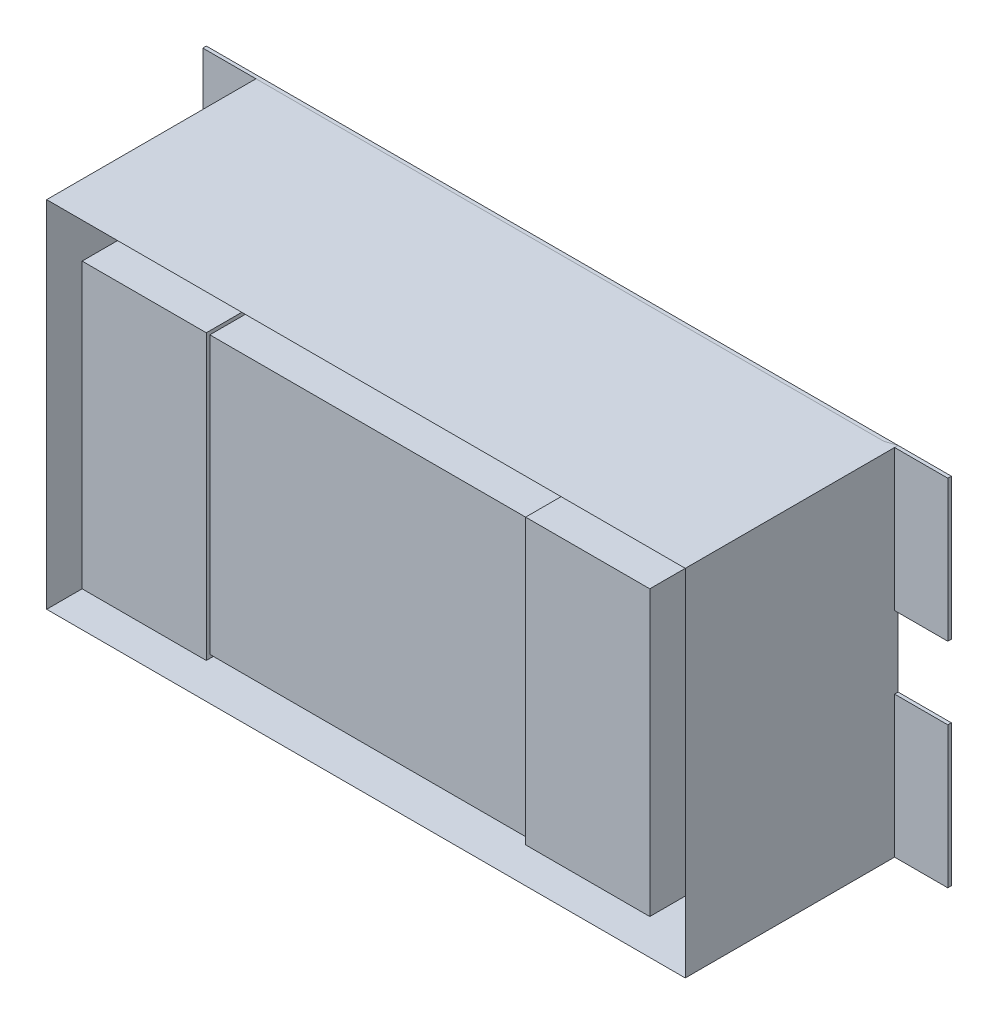
ISO-10303-21;
HEADER;
FILE_DESCRIPTION(('STEP AP214'),'2;1');
FILE_NAME('part.step','',(''),(''),'','','');
FILE_SCHEMA(('AUTOMOTIVE_DESIGN { 1 0 10303 214 1 1 1 1 }'));
ENDSEC;
DATA;
#1=APPLICATION_CONTEXT('core data for automotive mechanical design processes');
#2=APPLICATION_PROTOCOL_DEFINITION('international standard','automotive_design',2000,#1);
#3=PRODUCT_CONTEXT('',#1,'mechanical');
#4=PRODUCT('Part','Part','',(#3));
#5=PRODUCT_RELATED_PRODUCT_CATEGORY('part','',(#4));
#6=PRODUCT_DEFINITION_FORMATION('','',#4);
#7=PRODUCT_DEFINITION_CONTEXT('part definition',#1,'design');
#8=PRODUCT_DEFINITION('design','',#6,#7);
#9=PRODUCT_DEFINITION_SHAPE('','',#8);
#10=(LENGTH_UNIT() NAMED_UNIT(*) SI_UNIT(.MILLI.,.METRE.));
#11=(NAMED_UNIT(*) PLANE_ANGLE_UNIT() SI_UNIT($,.RADIAN.));
#12=(NAMED_UNIT(*) SI_UNIT($,.STERADIAN.) SOLID_ANGLE_UNIT());
#13=UNCERTAINTY_MEASURE_WITH_UNIT(LENGTH_MEASURE(1.E-05),#10,'distance_accuracy_value','');
#14=(GEOMETRIC_REPRESENTATION_CONTEXT(3) GLOBAL_UNCERTAINTY_ASSIGNED_CONTEXT((#13)) GLOBAL_UNIT_ASSIGNED_CONTEXT((#10,
#11,#12)) REPRESENTATION_CONTEXT('',''));
#15=CARTESIAN_POINT('',(0.,0.,0.));
#16=DIRECTION('',(0.,0.,1.));
#17=DIRECTION('',(1.,0.,0.));
#18=AXIS2_PLACEMENT_3D('',#15,#16,#17);
#19=CARTESIAN_POINT('',(1.05,-0.5,0.0762));
#20=DIRECTION('',(1.,0.,0.));
#21=DIRECTION('',(0.,1.,0.));
#22=AXIS2_PLACEMENT_3D('',#19,#20,#21);
#23=PLANE('',#22);
#24=DIRECTION('',(0.,0.,1.));
#25=VECTOR('',#24,1.);
#26=CARTESIAN_POINT('',(1.05,-0.102,0.0762));
#27=LINE('',#26,#25);
#28=CARTESIAN_POINT('',(1.05,-0.102,0.0762));
#29=VERTEX_POINT('',#28);
#30=CARTESIAN_POINT('',(1.05,-0.102,0.0862));
#31=VERTEX_POINT('',#30);
#32=EDGE_CURVE('P0_E253',#29,#31,#27,.T.);
#33=ORIENTED_EDGE('',*,*,#32,.T.);
#34=DIRECTION('',(0.,1.,0.));
#35=VECTOR('',#34,1.);
#36=CARTESIAN_POINT('',(1.05,-0.5,0.0862));
#37=LINE('',#36,#35);
#38=CARTESIAN_POINT('',(1.05,-0.5,0.0862));
#39=VERTEX_POINT('',#38);
#40=EDGE_CURVE('P0_E391',#39,#31,#37,.T.);
#41=ORIENTED_EDGE('',*,*,#40,.F.);
#42=DIRECTION('',(0.,0.,1.));
#43=VECTOR('',#42,1.);
#44=CARTESIAN_POINT('',(1.05,-0.5,0.0762));
#45=LINE('',#44,#43);
#46=CARTESIAN_POINT('',(1.05,-0.5,0.0762));
#47=VERTEX_POINT('',#46);
#48=EDGE_CURVE('P0_E11',#47,#39,#45,.T.);
#49=ORIENTED_EDGE('',*,*,#48,.F.);
#50=DIRECTION('',(0.,1.,0.));
#51=VECTOR('',#50,1.);
#52=CARTESIAN_POINT('',(1.05,-0.5,0.0762));
#53=LINE('',#52,#51);
#54=EDGE_CURVE('P0_E318',#47,#29,#53,.T.);
#55=ORIENTED_EDGE('',*,*,#54,.T.);
#56=EDGE_LOOP('',(#33,#41,#49,#55));
#57=FACE_BOUND('',#56,.T.);
#58=ADVANCED_FACE('P0_F18',(#57),#23,.T.);
#59=CARTESIAN_POINT('',(-1.05,-0.5,0.0762));
#60=DIRECTION('',(0.,-1.,0.));
#61=DIRECTION('',(0.,0.,-1.));
#62=AXIS2_PLACEMENT_3D('',#59,#60,#61);
#63=PLANE('',#62);
#64=ORIENTED_EDGE('',*,*,#48,.T.);
#65=DIRECTION('',(1.,0.,0.));
#66=VECTOR('',#65,1.);
#67=CARTESIAN_POINT('',(-1.05,-0.5,0.0862));
#68=LINE('',#67,#66);
#69=CARTESIAN_POINT('',(-1.05,-0.5,0.0862));
#70=VERTEX_POINT('',#69);
#71=EDGE_CURVE('P0_E236',#70,#39,#68,.T.);
#72=ORIENTED_EDGE('',*,*,#71,.F.);
#73=DIRECTION('',(0.,0.,1.));
#74=VECTOR('',#73,1.);
#75=CARTESIAN_POINT('',(-1.05,-0.5,0.0762));
#76=LINE('',#75,#74);
#77=CARTESIAN_POINT('',(-1.05,-0.5,0.0762));
#78=VERTEX_POINT('',#77);
#79=EDGE_CURVE('P0_E29',#78,#70,#76,.T.);
#80=ORIENTED_EDGE('',*,*,#79,.F.);
#81=DIRECTION('',(1.,0.,0.));
#82=VECTOR('',#81,1.);
#83=CARTESIAN_POINT('',(-1.05,-0.5,0.0762));
#84=LINE('',#83,#82);
#85=EDGE_CURVE('P0_E314',#78,#47,#84,.T.);
#86=ORIENTED_EDGE('',*,*,#85,.T.);
#87=EDGE_LOOP('',(#64,#72,#80,#86));
#88=FACE_BOUND('',#87,.T.);
#89=ADVANCED_FACE('P0_F1241',(#88),#63,.T.);
#90=CARTESIAN_POINT('',(-1.05,-0.102,0.0762));
#91=DIRECTION('',(-1.,0.,0.));
#92=DIRECTION('',(0.,0.,1.));
#93=AXIS2_PLACEMENT_3D('',#90,#91,#92);
#94=PLANE('',#93);
#95=ORIENTED_EDGE('',*,*,#79,.T.);
#96=DIRECTION('',(0.,-1.,0.));
#97=VECTOR('',#96,1.);
#98=CARTESIAN_POINT('',(-1.05,-0.102,0.0862));
#99=LINE('',#98,#97);
#100=CARTESIAN_POINT('',(-1.05,-0.102,0.0862));
#101=VERTEX_POINT('',#100);
#102=EDGE_CURVE('P0_E289',#101,#70,#99,.T.);
#103=ORIENTED_EDGE('',*,*,#102,.F.);
#104=DIRECTION('',(0.,0.,1.));
#105=VECTOR('',#104,1.);
#106=CARTESIAN_POINT('',(-1.05,-0.102,0.0762));
#107=LINE('',#106,#105);
#108=CARTESIAN_POINT('',(-1.05,-0.102,0.0762));
#109=VERTEX_POINT('',#108);
#110=EDGE_CURVE('P0_E249',#109,#101,#107,.T.);
#111=ORIENTED_EDGE('',*,*,#110,.F.);
#112=DIRECTION('',(0.,-1.,0.));
#113=VECTOR('',#112,1.);
#114=CARTESIAN_POINT('',(-1.05,-0.102,0.0762));
#115=LINE('',#114,#113);
#116=EDGE_CURVE('P0_E308',#109,#78,#115,.T.);
#117=ORIENTED_EDGE('',*,*,#116,.T.);
#118=EDGE_LOOP('',(#95,#103,#111,#117));
#119=FACE_BOUND('',#118,.T.);
#120=ADVANCED_FACE('P0_F1279',(#119),#94,.T.);
#121=CARTESIAN_POINT('',(1.05,-0.102,0.0762));
#122=DIRECTION('',(0.,1.,0.));
#123=DIRECTION('',(1.,0.,0.));
#124=AXIS2_PLACEMENT_3D('',#121,#122,#123);
#125=PLANE('',#124);
#126=DIRECTION('',(-1.,0.,0.));
#127=VECTOR('',#126,1.);
#128=CARTESIAN_POINT('',(0.45,-0.102,0.0862));
#129=LINE('',#128,#127);
#130=CARTESIAN_POINT('',(0.45,-0.102,0.0862));
#131=VERTEX_POINT('',#130);
#132=CARTESIAN_POINT('',(-0.45,-0.102,0.0862));
#133=VERTEX_POINT('',#132);
#134=EDGE_CURVE('P0_E279',#131,#133,#129,.T.);
#135=ORIENTED_EDGE('',*,*,#134,.F.);
#136=DIRECTION('',(0.,0.,1.));
#137=VECTOR('',#136,1.);
#138=CARTESIAN_POINT('',(0.45,-0.102,0.0762));
#139=LINE('',#138,#137);
#140=CARTESIAN_POINT('',(0.45,-0.102,0.0762));
#141=VERTEX_POINT('',#140);
#142=EDGE_CURVE('P0_E270',#141,#131,#139,.T.);
#143=ORIENTED_EDGE('',*,*,#142,.F.);
#144=DIRECTION('',(-1.,0.,0.));
#145=VECTOR('',#144,1.);
#146=CARTESIAN_POINT('',(0.45,-0.102,0.0762));
#147=LINE('',#146,#145);
#148=CARTESIAN_POINT('',(-0.45,-0.102,0.0762));
#149=VERTEX_POINT('',#148);
#150=EDGE_CURVE('P0_E215',#141,#149,#147,.T.);
#151=ORIENTED_EDGE('',*,*,#150,.T.);
#152=DIRECTION('',(0.,0.,1.));
#153=VECTOR('',#152,1.);
#154=CARTESIAN_POINT('',(-0.45,-0.102,0.0762));
#155=LINE('',#154,#153);
#156=EDGE_CURVE('P0_E203',#149,#133,#155,.T.);
#157=ORIENTED_EDGE('',*,*,#156,.T.);
#158=EDGE_LOOP('',(#135,#143,#151,#157));
#159=FACE_BOUND('',#158,.T.);
#160=ADVANCED_FACE('P0_F1274',(#159),#125,.T.);
#161=CARTESIAN_POINT('',(1.05,-0.102,0.0762));
#162=DIRECTION('',(0.,1.,0.));
#163=DIRECTION('',(1.,0.,0.));
#164=AXIS2_PLACEMENT_3D('',#161,#162,#163);
#165=PLANE('',#164);
#166=DIRECTION('',(-1.,0.,0.));
#167=VECTOR('',#166,1.);
#168=CARTESIAN_POINT('',(1.05,-0.102,0.0862));
#169=LINE('',#168,#167);
#170=CARTESIAN_POINT('',(0.8,-0.102,0.0862));
#171=VERTEX_POINT('',#170);
#172=EDGE_CURVE('P0_E395',#31,#171,#169,.T.);
#173=ORIENTED_EDGE('',*,*,#172,.F.);
#174=ORIENTED_EDGE('',*,*,#32,.F.);
#175=DIRECTION('',(-1.,0.,0.));
#176=VECTOR('',#175,1.);
#177=CARTESIAN_POINT('',(1.05,-0.102,0.0762));
#178=LINE('',#177,#176);
#179=CARTESIAN_POINT('',(0.8,-0.102,0.0762));
#180=VERTEX_POINT('',#179);
#181=EDGE_CURVE('P0_E322',#29,#180,#178,.T.);
#182=ORIENTED_EDGE('',*,*,#181,.T.);
#183=DIRECTION('',(0.,0.,1.));
#184=VECTOR('',#183,1.);
#185=CARTESIAN_POINT('',(0.8,-0.102,0.0762));
#186=LINE('',#185,#184);
#187=EDGE_CURVE('P0_E303',#180,#171,#186,.T.);
#188=ORIENTED_EDGE('',*,*,#187,.T.);
#189=EDGE_LOOP('',(#173,#174,#182,#188));
#190=FACE_BOUND('',#189,.T.);
#191=ADVANCED_FACE('P0_F1187',(#190),#165,.T.);
#192=CARTESIAN_POINT('',(1.05,-0.102,0.0762));
#193=DIRECTION('',(0.,1.,0.));
#194=DIRECTION('',(1.,0.,0.));
#195=AXIS2_PLACEMENT_3D('',#192,#193,#194);
#196=PLANE('',#195);
#197=DIRECTION('',(-1.,0.,0.));
#198=VECTOR('',#197,1.);
#199=CARTESIAN_POINT('',(-0.8,-0.102,0.0762));
#200=LINE('',#199,#198);
#201=CARTESIAN_POINT('',(-0.8,-0.102,0.0762));
#202=VERTEX_POINT('',#201);
#203=EDGE_CURVE('P0_E232',#202,#109,#200,.T.);
#204=ORIENTED_EDGE('',*,*,#203,.T.);
#205=ORIENTED_EDGE('',*,*,#110,.T.);
#206=DIRECTION('',(-1.,0.,0.));
#207=VECTOR('',#206,1.);
#208=CARTESIAN_POINT('',(-0.8,-0.102,0.0862));
#209=LINE('',#208,#207);
#210=CARTESIAN_POINT('',(-0.8,-0.102,0.0862));
#211=VERTEX_POINT('',#210);
#212=EDGE_CURVE('P0_E293',#211,#101,#209,.T.);
#213=ORIENTED_EDGE('',*,*,#212,.F.);
#214=DIRECTION('',(0.,0.,1.));
#215=VECTOR('',#214,1.);
#216=CARTESIAN_POINT('',(-0.8,-0.102,0.0762));
#217=LINE('',#216,#215);
#218=EDGE_CURVE('P0_E323',#202,#211,#217,.T.);
#219=ORIENTED_EDGE('',*,*,#218,.F.);
#220=EDGE_LOOP('',(#204,#205,#213,#219));
#221=FACE_BOUND('',#220,.T.);
#222=ADVANCED_FACE('P0_F1182',(#221),#196,.T.);
#223=CARTESIAN_POINT('',(1.05,0.102,0.0762));
#224=DIRECTION('',(1.,0.,0.));
#225=DIRECTION('',(0.,1.,0.));
#226=AXIS2_PLACEMENT_3D('',#223,#224,#225);
#227=PLANE('',#226);
#228=DIRECTION('',(0.,0.,1.));
#229=VECTOR('',#228,1.);
#230=CARTESIAN_POINT('',(1.05,0.5,0.0762));
#231=LINE('',#230,#229);
#232=CARTESIAN_POINT('',(1.05,0.5,0.0762));
#233=VERTEX_POINT('',#232);
#234=CARTESIAN_POINT('',(1.05,0.5,0.0862));
#235=VERTEX_POINT('',#234);
#236=EDGE_CURVE('P0_E254',#233,#235,#231,.T.);
#237=ORIENTED_EDGE('',*,*,#236,.T.);
#238=DIRECTION('',(0.,1.,0.));
#239=VECTOR('',#238,1.);
#240=CARTESIAN_POINT('',(1.05,0.102,0.0862));
#241=LINE('',#240,#239);
#242=CARTESIAN_POINT('',(1.05,0.102,0.0862));
#243=VERTEX_POINT('',#242);
#244=EDGE_CURVE('P0_E258',#243,#235,#241,.T.);
#245=ORIENTED_EDGE('',*,*,#244,.F.);
#246=DIRECTION('',(0.,0.,1.));
#247=VECTOR('',#246,1.);
#248=CARTESIAN_POINT('',(1.05,0.102,0.0762));
#249=LINE('',#248,#247);
#250=CARTESIAN_POINT('',(1.05,0.102,0.0762));
#251=VERTEX_POINT('',#250);
#252=EDGE_CURVE('P0_E430',#251,#243,#249,.T.);
#253=ORIENTED_EDGE('',*,*,#252,.F.);
#254=DIRECTION('',(0.,1.,0.));
#255=VECTOR('',#254,1.);
#256=CARTESIAN_POINT('',(1.05,0.102,0.0762));
#257=LINE('',#256,#255);
#258=EDGE_CURVE('P0_E354',#251,#233,#257,.T.);
#259=ORIENTED_EDGE('',*,*,#258,.T.);
#260=EDGE_LOOP('',(#237,#245,#253,#259));
#261=FACE_BOUND('',#260,.T.);
#262=ADVANCED_FACE('P0_F588',(#261),#227,.T.);
#263=CARTESIAN_POINT('',(1.05,0.5,0.0762));
#264=DIRECTION('',(0.,1.,0.));
#265=DIRECTION('',(1.,0.,0.));
#266=AXIS2_PLACEMENT_3D('',#263,#264,#265);
#267=PLANE('',#266);
#268=DIRECTION('',(0.,0.,1.));
#269=VECTOR('',#268,1.);
#270=CARTESIAN_POINT('',(-1.05,0.5,0.0762));
#271=LINE('',#270,#269);
#272=CARTESIAN_POINT('',(-1.05,0.5,0.0762));
#273=VERTEX_POINT('',#272);
#274=CARTESIAN_POINT('',(-1.05,0.5,0.0862));
#275=VERTEX_POINT('',#274);
#276=EDGE_CURVE('P0_E448',#273,#275,#271,.T.);
#277=ORIENTED_EDGE('',*,*,#276,.T.);
#278=DIRECTION('',(-1.,0.,0.));
#279=VECTOR('',#278,1.);
#280=CARTESIAN_POINT('',(1.05,0.5,0.0862));
#281=LINE('',#280,#279);
#282=EDGE_CURVE('P0_E262',#235,#275,#281,.T.);
#283=ORIENTED_EDGE('',*,*,#282,.F.);
#284=ORIENTED_EDGE('',*,*,#236,.F.);
#285=DIRECTION('',(-1.,0.,0.));
#286=VECTOR('',#285,1.);
#287=CARTESIAN_POINT('',(1.05,0.5,0.0762));
#288=LINE('',#287,#286);
#289=EDGE_CURVE('P0_E359',#233,#273,#288,.T.);
#290=ORIENTED_EDGE('',*,*,#289,.T.);
#291=EDGE_LOOP('',(#277,#283,#284,#290));
#292=FACE_BOUND('',#291,.T.);
#293=ADVANCED_FACE('P0_F593',(#292),#267,.T.);
#294=CARTESIAN_POINT('',(-1.05,0.5,0.0762));
#295=DIRECTION('',(-1.,0.,0.));
#296=DIRECTION('',(0.,0.,1.));
#297=AXIS2_PLACEMENT_3D('',#294,#295,#296);
#298=PLANE('',#297);
#299=DIRECTION('',(0.,0.,1.));
#300=VECTOR('',#299,1.);
#301=CARTESIAN_POINT('',(-1.05,0.102,0.0762));
#302=LINE('',#301,#300);
#303=CARTESIAN_POINT('',(-1.05,0.102,0.0762));
#304=VERTEX_POINT('',#303);
#305=CARTESIAN_POINT('',(-1.05,0.102,0.0862));
#306=VERTEX_POINT('',#305);
#307=EDGE_CURVE('P0_E425',#304,#306,#302,.T.);
#308=ORIENTED_EDGE('',*,*,#307,.T.);
#309=DIRECTION('',(0.,-1.,0.));
#310=VECTOR('',#309,1.);
#311=CARTESIAN_POINT('',(-1.05,0.5,0.0862));
#312=LINE('',#311,#310);
#313=EDGE_CURVE('P0_E417',#275,#306,#312,.T.);
#314=ORIENTED_EDGE('',*,*,#313,.F.);
#315=ORIENTED_EDGE('',*,*,#276,.F.);
#316=DIRECTION('',(0.,-1.,0.));
#317=VECTOR('',#316,1.);
#318=CARTESIAN_POINT('',(-1.05,0.5,0.0762));
#319=LINE('',#318,#317);
#320=EDGE_CURVE('P0_E369',#273,#304,#319,.T.);
#321=ORIENTED_EDGE('',*,*,#320,.T.);
#322=EDGE_LOOP('',(#308,#314,#315,#321));
#323=FACE_BOUND('',#322,.T.);
#324=ADVANCED_FACE('P0_F1175',(#323),#298,.T.);
#325=CARTESIAN_POINT('',(-1.05,0.102,0.0762));
#326=DIRECTION('',(0.,-1.,0.));
#327=DIRECTION('',(0.,0.,-1.));
#328=AXIS2_PLACEMENT_3D('',#325,#326,#327);
#329=PLANE('',#328);
#330=DIRECTION('',(1.,0.,0.));
#331=VECTOR('',#330,1.);
#332=CARTESIAN_POINT('',(-0.45,0.102,0.0762));
#333=LINE('',#332,#331);
#334=CARTESIAN_POINT('',(-0.45,0.102,0.0762));
#335=VERTEX_POINT('',#334);
#336=CARTESIAN_POINT('',(0.45,0.102,0.0762));
#337=VERTEX_POINT('',#336);
#338=EDGE_CURVE('P0_E195',#335,#337,#333,.T.);
#339=ORIENTED_EDGE('',*,*,#338,.T.);
#340=DIRECTION('',(0.,0.,1.));
#341=VECTOR('',#340,1.);
#342=CARTESIAN_POINT('',(0.45,0.102,0.0762));
#343=LINE('',#342,#341);
#344=CARTESIAN_POINT('',(0.45,0.102,0.0862));
#345=VERTEX_POINT('',#344);
#346=EDGE_CURVE('P0_E268',#337,#345,#343,.T.);
#347=ORIENTED_EDGE('',*,*,#346,.T.);
#348=DIRECTION('',(1.,0.,0.));
#349=VECTOR('',#348,1.);
#350=CARTESIAN_POINT('',(-0.45,0.102,0.0862));
#351=LINE('',#350,#349);
#352=CARTESIAN_POINT('',(-0.45,0.102,0.0862));
#353=VERTEX_POINT('',#352);
#354=EDGE_CURVE('P0_E197',#353,#345,#351,.T.);
#355=ORIENTED_EDGE('',*,*,#354,.F.);
#356=DIRECTION('',(0.,0.,1.));
#357=VECTOR('',#356,1.);
#358=CARTESIAN_POINT('',(-0.45,0.102,0.0762));
#359=LINE('',#358,#357);
#360=EDGE_CURVE('P0_E190',#335,#353,#359,.T.);
#361=ORIENTED_EDGE('',*,*,#360,.F.);
#362=EDGE_LOOP('',(#339,#347,#355,#361));
#363=FACE_BOUND('',#362,.T.);
#364=ADVANCED_FACE('P0_F192',(#363),#329,.T.);
#365=CARTESIAN_POINT('',(-1.05,0.102,0.0762));
#366=DIRECTION('',(0.,-1.,0.));
#367=DIRECTION('',(0.,0.,-1.));
#368=AXIS2_PLACEMENT_3D('',#365,#366,#367);
#369=PLANE('',#368);
#370=DIRECTION('',(1.,0.,0.));
#371=VECTOR('',#370,1.);
#372=CARTESIAN_POINT('',(0.8,0.102,0.0762));
#373=LINE('',#372,#371);
#374=CARTESIAN_POINT('',(0.8,0.102,0.0762));
#375=VERTEX_POINT('',#374);
#376=EDGE_CURVE('P0_E358',#375,#251,#373,.T.);
#377=ORIENTED_EDGE('',*,*,#376,.T.);
#378=ORIENTED_EDGE('',*,*,#252,.T.);
#379=DIRECTION('',(1.,0.,0.));
#380=VECTOR('',#379,1.);
#381=CARTESIAN_POINT('',(0.8,0.102,0.0862));
#382=LINE('',#381,#380);
#383=CARTESIAN_POINT('',(0.8,0.102,0.0862));
#384=VERTEX_POINT('',#383);
#385=EDGE_CURVE('P0_E263',#384,#243,#382,.T.);
#386=ORIENTED_EDGE('',*,*,#385,.F.);
#387=DIRECTION('',(0.,0.,1.));
#388=VECTOR('',#387,1.);
#389=CARTESIAN_POINT('',(0.8,0.102,0.0762));
#390=LINE('',#389,#388);
#391=EDGE_CURVE('P0_E257',#375,#384,#390,.T.);
#392=ORIENTED_EDGE('',*,*,#391,.F.);
#393=EDGE_LOOP('',(#377,#378,#386,#392));
#394=FACE_BOUND('',#393,.T.);
#395=ADVANCED_FACE('P0_F579',(#394),#369,.T.);
#396=CARTESIAN_POINT('',(-1.05,0.102,0.0762));
#397=DIRECTION('',(0.,-1.,0.));
#398=DIRECTION('',(0.,0.,-1.));
#399=AXIS2_PLACEMENT_3D('',#396,#397,#398);
#400=PLANE('',#399);
#401=DIRECTION('',(1.,0.,0.));
#402=VECTOR('',#401,1.);
#403=CARTESIAN_POINT('',(-1.05,0.102,0.0862));
#404=LINE('',#403,#402);
#405=CARTESIAN_POINT('',(-0.8,0.102,0.0862));
#406=VERTEX_POINT('',#405);
#407=EDGE_CURVE('P0_E421',#306,#406,#404,.T.);
#408=ORIENTED_EDGE('',*,*,#407,.F.);
#409=ORIENTED_EDGE('',*,*,#307,.F.);
#410=DIRECTION('',(1.,0.,0.));
#411=VECTOR('',#410,1.);
#412=CARTESIAN_POINT('',(-1.05,0.102,0.0762));
#413=LINE('',#412,#411);
#414=CARTESIAN_POINT('',(-0.8,0.102,0.0762));
#415=VERTEX_POINT('',#414);
#416=EDGE_CURVE('P0_E373',#304,#415,#413,.T.);
#417=ORIENTED_EDGE('',*,*,#416,.T.);
#418=DIRECTION('',(0.,0.,1.));
#419=VECTOR('',#418,1.);
#420=CARTESIAN_POINT('',(-0.8,0.102,0.0762));
#421=LINE('',#420,#419);
#422=EDGE_CURVE('P0_E328',#415,#406,#421,.T.);
#423=ORIENTED_EDGE('',*,*,#422,.T.);
#424=EDGE_LOOP('',(#408,#409,#417,#423));
#425=FACE_BOUND('',#424,.T.);
#426=ADVANCED_FACE('P0_F515',(#425),#400,.T.);
#427=CARTESIAN_POINT('',(0.,0.,0.6762));
#428=DIRECTION('',(0.,0.,1.));
#429=DIRECTION('',(1.,0.,0.));
#430=AXIS2_PLACEMENT_3D('',#427,#428,#429);
#431=PLANE('',#430);
#432=DIRECTION('',(1.,0.,0.));
#433=VECTOR('',#432,1.);
#434=CARTESIAN_POINT('',(0.45,-0.4,0.6762));
#435=LINE('',#434,#433);
#436=CARTESIAN_POINT('',(0.45,-0.4,0.6762));
#437=VERTEX_POINT('',#436);
#438=CARTESIAN_POINT('',(0.8,-0.4,0.6762));
#439=VERTEX_POINT('',#438);
#440=EDGE_CURVE('P0_E43',#437,#439,#435,.T.);
#441=ORIENTED_EDGE('',*,*,#440,.T.);
#442=DIRECTION('',(0.,1.,0.));
#443=VECTOR('',#442,1.);
#444=CARTESIAN_POINT('',(0.8,-0.4,0.6762));
#445=LINE('',#444,#443);
#446=CARTESIAN_POINT('',(0.8,0.4,0.6762));
#447=VERTEX_POINT('',#446);
#448=EDGE_CURVE('P0_E245',#439,#447,#445,.T.);
#449=ORIENTED_EDGE('',*,*,#448,.T.);
#450=DIRECTION('',(-1.,0.,0.));
#451=VECTOR('',#450,1.);
#452=CARTESIAN_POINT('',(0.8,0.4,0.6762));
#453=LINE('',#452,#451);
#454=CARTESIAN_POINT('',(0.45,0.4,0.6762));
#455=VERTEX_POINT('',#454);
#456=EDGE_CURVE('P0_E298',#447,#455,#453,.T.);
#457=ORIENTED_EDGE('',*,*,#456,.T.);
#458=DIRECTION('',(0.,1.,0.));
#459=VECTOR('',#458,1.);
#460=CARTESIAN_POINT('',(0.45,-0.4,0.6762));
#461=LINE('',#460,#459);
#462=EDGE_CURVE('P0_E364',#437,#455,#461,.T.);
#463=ORIENTED_EDGE('',*,*,#462,.F.);
#464=EDGE_LOOP('',(#441,#449,#457,#463));
#465=FACE_BOUND('',#464,.T.);
#466=ADVANCED_FACE('P0_F1146',(#465),#431,.T.);
#467=CARTESIAN_POINT('',(0.,0.,0.6762));
#468=DIRECTION('',(0.,0.,1.));
#469=DIRECTION('',(1.,0.,0.));
#470=AXIS2_PLACEMENT_3D('',#467,#468,#469);
#471=PLANE('',#470);
#472=DIRECTION('',(-1.,0.,0.));
#473=VECTOR('',#472,1.);
#474=CARTESIAN_POINT('',(-0.45,0.4,0.6762));
#475=LINE('',#474,#473);
#476=CARTESIAN_POINT('',(-0.45,0.4,0.6762));
#477=VERTEX_POINT('',#476);
#478=CARTESIAN_POINT('',(-0.8,0.4,0.6762));
#479=VERTEX_POINT('',#478);
#480=EDGE_CURVE('P0_E300',#477,#479,#475,.T.);
#481=ORIENTED_EDGE('',*,*,#480,.T.);
#482=DIRECTION('',(0.,-1.,0.));
#483=VECTOR('',#482,1.);
#484=CARTESIAN_POINT('',(-0.8,0.4,0.6762));
#485=LINE('',#484,#483);
#486=CARTESIAN_POINT('',(-0.8,-0.4,0.6762));
#487=VERTEX_POINT('',#486);
#488=EDGE_CURVE('P0_E299',#479,#487,#485,.T.);
#489=ORIENTED_EDGE('',*,*,#488,.T.);
#490=DIRECTION('',(1.,0.,0.));
#491=VECTOR('',#490,1.);
#492=CARTESIAN_POINT('',(-0.8,-0.4,0.6762));
#493=LINE('',#492,#491);
#494=CARTESIAN_POINT('',(-0.45,-0.4,0.6762));
#495=VERTEX_POINT('',#494);
#496=EDGE_CURVE('P0_E244',#487,#495,#493,.T.);
#497=ORIENTED_EDGE('',*,*,#496,.T.);
#498=DIRECTION('',(0.,1.,0.));
#499=VECTOR('',#498,1.);
#500=CARTESIAN_POINT('',(-0.45,-0.4,0.6762));
#501=LINE('',#500,#499);
#502=EDGE_CURVE('P0_E313',#495,#477,#501,.T.);
#503=ORIENTED_EDGE('',*,*,#502,.T.);
#504=EDGE_LOOP('',(#481,#489,#497,#503));
#505=FACE_BOUND('',#504,.T.);
#506=ADVANCED_FACE('P0_F1203',(#505),#471,.T.);
#507=CARTESIAN_POINT('',(-0.8,-0.4,0.0762));
#508=DIRECTION('',(0.,-1.,0.));
#509=DIRECTION('',(0.,0.,-1.));
#510=AXIS2_PLACEMENT_3D('',#507,#508,#509);
#511=PLANE('',#510);
#512=DIRECTION('',(0.,0.,1.));
#513=VECTOR('',#512,1.);
#514=CARTESIAN_POINT('',(0.8,-0.4,0.0862));
#515=LINE('',#514,#513);
#516=CARTESIAN_POINT('',(0.8,-0.4,0.0862));
#517=VERTEX_POINT('',#516);
#518=EDGE_CURVE('P0_E242',#517,#439,#515,.T.);
#519=ORIENTED_EDGE('',*,*,#518,.T.);
#520=ORIENTED_EDGE('',*,*,#440,.F.);
#521=DIRECTION('',(0.,0.,1.));
#522=VECTOR('',#521,1.);
#523=CARTESIAN_POINT('',(0.45,-0.4,0.0862));
#524=LINE('',#523,#522);
#525=CARTESIAN_POINT('',(0.45,-0.4,0.0862));
#526=VERTEX_POINT('',#525);
#527=EDGE_CURVE('P0_E360',#526,#437,#524,.T.);
#528=ORIENTED_EDGE('',*,*,#527,.F.);
#529=DIRECTION('',(1.,0.,0.));
#530=VECTOR('',#529,1.);
#531=CARTESIAN_POINT('',(0.45,-0.4,0.0862));
#532=LINE('',#531,#530);
#533=EDGE_CURVE('P0_E275',#526,#517,#532,.T.);
#534=ORIENTED_EDGE('',*,*,#533,.T.);
#535=EDGE_LOOP('',(#519,#520,#528,#534));
#536=FACE_BOUND('',#535,.T.);
#537=ADVANCED_FACE('P0_F1197',(#536),#511,.T.);
#538=CARTESIAN_POINT('',(-0.8,-0.4,0.0762));
#539=DIRECTION('',(0.,-1.,0.));
#540=DIRECTION('',(0.,0.,-1.));
#541=AXIS2_PLACEMENT_3D('',#538,#539,#540);
#542=PLANE('',#541);
#543=DIRECTION('',(0.,0.,1.));
#544=VECTOR('',#543,1.);
#545=CARTESIAN_POINT('',(-0.45,-0.4,0.0862));
#546=LINE('',#545,#544);
#547=CARTESIAN_POINT('',(-0.45,-0.4,0.0862));
#548=VERTEX_POINT('',#547);
#549=EDGE_CURVE('P0_E387',#548,#495,#546,.T.);
#550=ORIENTED_EDGE('',*,*,#549,.T.);
#551=ORIENTED_EDGE('',*,*,#496,.F.);
#552=DIRECTION('',(0.,0.,1.));
#553=VECTOR('',#552,1.);
#554=CARTESIAN_POINT('',(-0.8,-0.4,0.0862));
#555=LINE('',#554,#553);
#556=CARTESIAN_POINT('',(-0.8,-0.4,0.0862));
#557=VERTEX_POINT('',#556);
#558=EDGE_CURVE('P0_E327',#557,#487,#555,.T.);
#559=ORIENTED_EDGE('',*,*,#558,.F.);
#560=DIRECTION('',(1.,0.,0.));
#561=VECTOR('',#560,1.);
#562=CARTESIAN_POINT('',(-0.8,-0.4,0.0862));
#563=LINE('',#562,#561);
#564=EDGE_CURVE('P0_E347',#557,#548,#563,.T.);
#565=ORIENTED_EDGE('',*,*,#564,.T.);
#566=EDGE_LOOP('',(#550,#551,#559,#565));
#567=FACE_BOUND('',#566,.T.);
#568=ADVANCED_FACE('P0_F1202',(#567),#542,.T.);
#569=CARTESIAN_POINT('',(0.8,-0.4,0.0762));
#570=DIRECTION('',(1.,0.,0.));
#571=DIRECTION('',(0.,1.,0.));
#572=AXIS2_PLACEMENT_3D('',#569,#570,#571);
#573=PLANE('',#572);
#574=ORIENTED_EDGE('',*,*,#187,.F.);
#575=DIRECTION('',(0.,1.,0.));
#576=VECTOR('',#575,1.);
#577=CARTESIAN_POINT('',(0.8,-0.102,0.0762));
#578=LINE('',#577,#576);
#579=EDGE_CURVE('P0_E405',#180,#375,#578,.T.);
#580=ORIENTED_EDGE('',*,*,#579,.T.);
#581=ORIENTED_EDGE('',*,*,#391,.T.);
#582=DIRECTION('',(0.,1.,0.));
#583=VECTOR('',#582,1.);
#584=CARTESIAN_POINT('',(0.8,0.102,0.0862));
#585=LINE('',#584,#583);
#586=CARTESIAN_POINT('',(0.8,0.4,0.0862));
#587=VERTEX_POINT('',#586);
#588=EDGE_CURVE('P0_E288',#384,#587,#585,.T.);
#589=ORIENTED_EDGE('',*,*,#588,.T.);
#590=DIRECTION('',(0.,0.,1.));
#591=VECTOR('',#590,1.);
#592=CARTESIAN_POINT('',(0.8,0.4,0.0862));
#593=LINE('',#592,#591);
#594=EDGE_CURVE('P0_E304',#587,#447,#593,.T.);
#595=ORIENTED_EDGE('',*,*,#594,.T.);
#596=ORIENTED_EDGE('',*,*,#448,.F.);
#597=ORIENTED_EDGE('',*,*,#518,.F.);
#598=DIRECTION('',(0.,1.,0.));
#599=VECTOR('',#598,1.);
#600=CARTESIAN_POINT('',(0.8,-0.4,0.0862));
#601=LINE('',#600,#599);
#602=EDGE_CURVE('P0_E280',#517,#171,#601,.T.);
#603=ORIENTED_EDGE('',*,*,#602,.T.);
#604=EDGE_LOOP('',(#574,#580,#581,#589,#595,#596,#597,#603));
#605=FACE_BOUND('',#604,.T.);
#606=ADVANCED_FACE('P0_F585',(#605),#573,.T.);
#607=CARTESIAN_POINT('',(0.8,0.4,0.0762));
#608=DIRECTION('',(0.,1.,0.));
#609=DIRECTION('',(1.,0.,0.));
#610=AXIS2_PLACEMENT_3D('',#607,#608,#609);
#611=PLANE('',#610);
#612=DIRECTION('',(0.,0.,1.));
#613=VECTOR('',#612,1.);
#614=CARTESIAN_POINT('',(-0.8,0.4,0.0862));
#615=LINE('',#614,#613);
#616=CARTESIAN_POINT('',(-0.8,0.4,0.0862));
#617=VERTEX_POINT('',#616);
#618=EDGE_CURVE('P0_E294',#617,#479,#615,.T.);
#619=ORIENTED_EDGE('',*,*,#618,.T.);
#620=ORIENTED_EDGE('',*,*,#480,.F.);
#621=DIRECTION('',(0.,0.,1.));
#622=VECTOR('',#621,1.);
#623=CARTESIAN_POINT('',(-0.45,0.4,0.0862));
#624=LINE('',#623,#622);
#625=CARTESIAN_POINT('',(-0.45,0.4,0.0862));
#626=VERTEX_POINT('',#625);
#627=EDGE_CURVE('P0_E309',#626,#477,#624,.T.);
#628=ORIENTED_EDGE('',*,*,#627,.F.);
#629=DIRECTION('',(-1.,0.,0.));
#630=VECTOR('',#629,1.);
#631=CARTESIAN_POINT('',(-0.45,0.4,0.0862));
#632=LINE('',#631,#630);
#633=EDGE_CURVE('P0_E238',#626,#617,#632,.T.);
#634=ORIENTED_EDGE('',*,*,#633,.T.);
#635=EDGE_LOOP('',(#619,#620,#628,#634));
#636=FACE_BOUND('',#635,.T.);
#637=ADVANCED_FACE('P0_F1228',(#636),#611,.T.);
#638=CARTESIAN_POINT('',(0.8,0.4,0.0762));
#639=DIRECTION('',(0.,1.,0.));
#640=DIRECTION('',(1.,0.,0.));
#641=AXIS2_PLACEMENT_3D('',#638,#639,#640);
#642=PLANE('',#641);
#643=DIRECTION('',(0.,0.,1.));
#644=VECTOR('',#643,1.);
#645=CARTESIAN_POINT('',(0.45,0.4,0.0862));
#646=LINE('',#645,#644);
#647=CARTESIAN_POINT('',(0.45,0.4,0.0862));
#648=VERTEX_POINT('',#647);
#649=EDGE_CURVE('P0_E269',#648,#455,#646,.T.);
#650=ORIENTED_EDGE('',*,*,#649,.T.);
#651=ORIENTED_EDGE('',*,*,#456,.F.);
#652=ORIENTED_EDGE('',*,*,#594,.F.);
#653=DIRECTION('',(-1.,0.,0.));
#654=VECTOR('',#653,1.);
#655=CARTESIAN_POINT('',(0.8,0.4,0.0862));
#656=LINE('',#655,#654);
#657=EDGE_CURVE('P0_E475',#587,#648,#656,.T.);
#658=ORIENTED_EDGE('',*,*,#657,.T.);
#659=EDGE_LOOP('',(#650,#651,#652,#658));
#660=FACE_BOUND('',#659,.T.);
#661=ADVANCED_FACE('P0_F598',(#660),#642,.T.);
#662=CARTESIAN_POINT('',(-0.8,0.4,0.0762));
#663=DIRECTION('',(-1.,0.,0.));
#664=DIRECTION('',(0.,0.,1.));
#665=AXIS2_PLACEMENT_3D('',#662,#663,#664);
#666=PLANE('',#665);
#667=ORIENTED_EDGE('',*,*,#422,.F.);
#668=DIRECTION('',(0.,-1.,0.));
#669=VECTOR('',#668,1.);
#670=CARTESIAN_POINT('',(-0.8,0.102,0.0762));
#671=LINE('',#670,#669);
#672=EDGE_CURVE('P0_E223',#415,#202,#671,.T.);
#673=ORIENTED_EDGE('',*,*,#672,.T.);
#674=ORIENTED_EDGE('',*,*,#218,.T.);
#675=DIRECTION('',(0.,-1.,0.));
#676=VECTOR('',#675,1.);
#677=CARTESIAN_POINT('',(-0.8,-0.102,0.0862));
#678=LINE('',#677,#676);
#679=EDGE_CURVE('P0_E343',#211,#557,#678,.T.);
#680=ORIENTED_EDGE('',*,*,#679,.T.);
#681=ORIENTED_EDGE('',*,*,#558,.T.);
#682=ORIENTED_EDGE('',*,*,#488,.F.);
#683=ORIENTED_EDGE('',*,*,#618,.F.);
#684=DIRECTION('',(0.,-1.,0.));
#685=VECTOR('',#684,1.);
#686=CARTESIAN_POINT('',(-0.8,0.4,0.0862));
#687=LINE('',#686,#685);
#688=EDGE_CURVE('P0_E458',#617,#406,#687,.T.);
#689=ORIENTED_EDGE('',*,*,#688,.T.);
#690=EDGE_LOOP('',(#667,#673,#674,#680,#681,#682,#683,#689));
#691=FACE_BOUND('',#690,.T.);
#692=ADVANCED_FACE('P0_F502',(#691),#666,.T.);
#693=CARTESIAN_POINT('',(0.,0.,0.0862));
#694=DIRECTION('',(0.,0.,1.));
#695=DIRECTION('',(1.,0.,0.));
#696=AXIS2_PLACEMENT_3D('',#693,#694,#695);
#697=PLANE('',#696);
#698=ORIENTED_EDGE('',*,*,#212,.T.);
#699=ORIENTED_EDGE('',*,*,#102,.T.);
#700=ORIENTED_EDGE('',*,*,#71,.T.);
#701=ORIENTED_EDGE('',*,*,#40,.T.);
#702=ORIENTED_EDGE('',*,*,#172,.T.);
#703=ORIENTED_EDGE('',*,*,#602,.F.);
#704=ORIENTED_EDGE('',*,*,#533,.F.);
#705=DIRECTION('',(0.,1.,0.));
#706=VECTOR('',#705,1.);
#707=CARTESIAN_POINT('',(0.45,-0.4,0.0862));
#708=LINE('',#707,#706);
#709=EDGE_CURVE('P0_E274',#526,#131,#708,.T.);
#710=ORIENTED_EDGE('',*,*,#709,.T.);
#711=ORIENTED_EDGE('',*,*,#134,.T.);
#712=DIRECTION('',(0.,1.,0.));
#713=VECTOR('',#712,1.);
#714=CARTESIAN_POINT('',(-0.45,-0.4,0.0862));
#715=LINE('',#714,#713);
#716=EDGE_CURVE('P0_E416',#548,#133,#715,.T.);
#717=ORIENTED_EDGE('',*,*,#716,.F.);
#718=ORIENTED_EDGE('',*,*,#564,.F.);
#719=ORIENTED_EDGE('',*,*,#679,.F.);
#720=EDGE_LOOP('',(#698,#699,#700,#701,#702,#703,#704,#710,#711,#717,#718,#719));
#721=FACE_BOUND('',#720,.T.);
#722=ADVANCED_FACE('P0_F1381',(#721),#697,.T.);
#723=CARTESIAN_POINT('',(0.,0.,0.0862));
#724=DIRECTION('',(0.,0.,1.));
#725=DIRECTION('',(1.,0.,0.));
#726=AXIS2_PLACEMENT_3D('',#723,#724,#725);
#727=PLANE('',#726);
#728=ORIENTED_EDGE('',*,*,#633,.F.);
#729=DIRECTION('',(0.,1.,0.));
#730=VECTOR('',#729,1.);
#731=CARTESIAN_POINT('',(-0.45,0.102,0.0862));
#732=LINE('',#731,#730);
#733=EDGE_CURVE('P0_E202',#353,#626,#732,.T.);
#734=ORIENTED_EDGE('',*,*,#733,.F.);
#735=ORIENTED_EDGE('',*,*,#354,.T.);
#736=DIRECTION('',(0.,1.,0.));
#737=VECTOR('',#736,1.);
#738=CARTESIAN_POINT('',(0.45,0.102,0.0862));
#739=LINE('',#738,#737);
#740=EDGE_CURVE('P0_E264',#345,#648,#739,.T.);
#741=ORIENTED_EDGE('',*,*,#740,.T.);
#742=ORIENTED_EDGE('',*,*,#657,.F.);
#743=ORIENTED_EDGE('',*,*,#588,.F.);
#744=ORIENTED_EDGE('',*,*,#385,.T.);
#745=ORIENTED_EDGE('',*,*,#244,.T.);
#746=ORIENTED_EDGE('',*,*,#282,.T.);
#747=ORIENTED_EDGE('',*,*,#313,.T.);
#748=ORIENTED_EDGE('',*,*,#407,.T.);
#749=ORIENTED_EDGE('',*,*,#688,.F.);
#750=EDGE_LOOP('',(#728,#734,#735,#741,#742,#743,#744,#745,#746,#747,#748,#749));
#751=FACE_BOUND('',#750,.T.);
#752=ADVANCED_FACE('P0_F511',(#751),#727,.T.);
#753=CARTESIAN_POINT('',(-0.45,-0.39,0.6662));
#754=DIRECTION('',(0.,0.,-1.));
#755=DIRECTION('',(0.,-1.,0.));
#756=AXIS2_PLACEMENT_3D('',#753,#754,#755);
#757=PLANE('',#756);
#758=DIRECTION('',(1.,0.,0.));
#759=VECTOR('',#758,1.);
#760=CARTESIAN_POINT('',(-0.45,-0.39,0.6662));
#761=LINE('',#760,#759);
#762=CARTESIAN_POINT('',(-0.45,-0.39,0.6662));
#763=VERTEX_POINT('',#762);
#764=CARTESIAN_POINT('',(0.45,-0.39,0.6662));
#765=VERTEX_POINT('',#764);
#766=EDGE_CURVE('P0_E241',#763,#765,#761,.T.);
#767=ORIENTED_EDGE('',*,*,#766,.T.);
#768=DIRECTION('',(0.,1.,0.));
#769=VECTOR('',#768,1.);
#770=CARTESIAN_POINT('',(0.45,-0.39,0.6662));
#771=LINE('',#770,#769);
#772=CARTESIAN_POINT('',(0.45,0.39,0.6662));
#773=VERTEX_POINT('',#772);
#774=EDGE_CURVE('P0_E374',#765,#773,#771,.T.);
#775=ORIENTED_EDGE('',*,*,#774,.T.);
#776=DIRECTION('',(1.,0.,0.));
#777=VECTOR('',#776,1.);
#778=CARTESIAN_POINT('',(-0.45,0.39,0.6662));
#779=LINE('',#778,#777);
#780=CARTESIAN_POINT('',(-0.45,0.39,0.6662));
#781=VERTEX_POINT('',#780);
#782=EDGE_CURVE('P0_E284',#781,#773,#779,.T.);
#783=ORIENTED_EDGE('',*,*,#782,.F.);
#784=DIRECTION('',(0.,1.,0.));
#785=VECTOR('',#784,1.);
#786=CARTESIAN_POINT('',(-0.45,-0.39,0.6662));
#787=LINE('',#786,#785);
#788=EDGE_CURVE('P0_E411',#763,#781,#787,.T.);
#789=ORIENTED_EDGE('',*,*,#788,.F.);
#790=EDGE_LOOP('',(#767,#775,#783,#789));
#791=FACE_BOUND('',#790,.T.);
#792=ADVANCED_FACE('P0_F1156',(#791),#757,.F.);
#793=CARTESIAN_POINT('',(-0.45,-0.39,0.0862));
#794=DIRECTION('',(0.,1.,0.));
#795=DIRECTION('',(1.,0.,0.));
#796=AXIS2_PLACEMENT_3D('',#793,#794,#795);
#797=PLANE('',#796);
#798=DIRECTION('',(0.,0.,1.));
#799=VECTOR('',#798,1.);
#800=CARTESIAN_POINT('',(0.45,-0.39,0.1012));
#801=LINE('',#800,#799);
#802=CARTESIAN_POINT('',(0.45,-0.39,0.1012));
#803=VERTEX_POINT('',#802);
#804=EDGE_CURVE('P0_E367',#803,#765,#801,.T.);
#805=ORIENTED_EDGE('',*,*,#804,.T.);
#806=ORIENTED_EDGE('',*,*,#766,.F.);
#807=DIRECTION('',(0.,0.,1.));
#808=VECTOR('',#807,1.);
#809=CARTESIAN_POINT('',(-0.45,-0.39,0.1012));
#810=LINE('',#809,#808);
#811=CARTESIAN_POINT('',(-0.45,-0.39,0.1012));
#812=VERTEX_POINT('',#811);
#813=EDGE_CURVE('P0_E415',#812,#763,#810,.T.);
#814=ORIENTED_EDGE('',*,*,#813,.F.);
#815=DIRECTION('',(1.,0.,0.));
#816=VECTOR('',#815,1.);
#817=CARTESIAN_POINT('',(-0.45,-0.39,0.1012));
#818=LINE('',#817,#816);
#819=EDGE_CURVE('P0_E22',#812,#803,#818,.T.);
#820=ORIENTED_EDGE('',*,*,#819,.T.);
#821=EDGE_LOOP('',(#805,#806,#814,#820));
#822=FACE_BOUND('',#821,.T.);
#823=ADVANCED_FACE('P0_F1161',(#822),#797,.F.);
#824=CARTESIAN_POINT('',(-0.45,0.,0.));
#825=DIRECTION('',(1.,0.,0.));
#826=DIRECTION('',(0.,1.,0.));
#827=AXIS2_PLACEMENT_3D('',#824,#825,#826);
#828=PLANE('',#827);
#829=ORIENTED_EDGE('',*,*,#788,.T.);
#830=DIRECTION('',(0.,0.,-1.));
#831=VECTOR('',#830,1.);
#832=CARTESIAN_POINT('',(-0.45,0.39,0.6662));
#833=LINE('',#832,#831);
#834=CARTESIAN_POINT('',(-0.45,0.39,0.1012));
#835=VERTEX_POINT('',#834);
#836=EDGE_CURVE('P0_E329',#781,#835,#833,.T.);
#837=ORIENTED_EDGE('',*,*,#836,.T.);
#838=DIRECTION('',(0.,1.,0.));
#839=VECTOR('',#838,1.);
#840=CARTESIAN_POINT('',(-0.45,-0.39,0.1012));
#841=LINE('',#840,#839);
#842=EDGE_CURVE('P0_E350',#812,#835,#841,.T.);
#843=ORIENTED_EDGE('',*,*,#842,.F.);
#844=ORIENTED_EDGE('',*,*,#813,.T.);
#845=EDGE_LOOP('',(#829,#837,#843,#844));
#846=FACE_BOUND('',#845,.T.);
#847=ORIENTED_EDGE('',*,*,#156,.F.);
#848=DIRECTION('',(0.,1.,0.));
#849=VECTOR('',#848,1.);
#850=CARTESIAN_POINT('',(-0.45,-0.102,0.0762));
#851=LINE('',#850,#849);
#852=EDGE_CURVE('P0_E207',#149,#335,#851,.T.);
#853=ORIENTED_EDGE('',*,*,#852,.T.);
#854=ORIENTED_EDGE('',*,*,#360,.T.);
#855=ORIENTED_EDGE('',*,*,#733,.T.);
#856=ORIENTED_EDGE('',*,*,#627,.T.);
#857=ORIENTED_EDGE('',*,*,#502,.F.);
#858=ORIENTED_EDGE('',*,*,#549,.F.);
#859=ORIENTED_EDGE('',*,*,#716,.T.);
#860=EDGE_LOOP('',(#847,#853,#854,#855,#856,#857,#858,#859));
#861=FACE_BOUND('',#860,.T.);
#862=ADVANCED_FACE('P0_F208',(#846,#861),#828,.T.);
#863=CARTESIAN_POINT('',(-0.45,0.,0.1012));
#864=DIRECTION('',(0.,0.,-1.));
#865=DIRECTION('',(0.,-1.,0.));
#866=AXIS2_PLACEMENT_3D('',#863,#864,#865);
#867=PLANE('',#866);
#868=DIRECTION('',(0.,-1.,0.));
#869=VECTOR('',#868,1.);
#870=CARTESIAN_POINT('',(0.45,0.39,0.1012));
#871=LINE('',#870,#869);
#872=CARTESIAN_POINT('',(0.45,0.39,0.1012));
#873=VERTEX_POINT('',#872);
#874=EDGE_CURVE('P0_E342',#873,#803,#871,.T.);
#875=ORIENTED_EDGE('',*,*,#874,.T.);
#876=ORIENTED_EDGE('',*,*,#819,.F.);
#877=ORIENTED_EDGE('',*,*,#842,.T.);
#878=DIRECTION('',(1.,0.,0.));
#879=VECTOR('',#878,1.);
#880=CARTESIAN_POINT('',(-0.45,0.39,0.1012));
#881=LINE('',#880,#879);
#882=EDGE_CURVE('P0_E281',#835,#873,#881,.T.);
#883=ORIENTED_EDGE('',*,*,#882,.T.);
#884=EDGE_LOOP('',(#875,#876,#877,#883));
#885=FACE_BOUND('',#884,.T.);
#886=ADVANCED_FACE('P0_F1265',(#885),#867,.T.);
#887=CARTESIAN_POINT('',(-0.45,0.39,0.6662));
#888=DIRECTION('',(0.,-1.,0.));
#889=DIRECTION('',(0.,0.,-1.));
#890=AXIS2_PLACEMENT_3D('',#887,#888,#889);
#891=PLANE('',#890);
#892=ORIENTED_EDGE('',*,*,#836,.F.);
#893=ORIENTED_EDGE('',*,*,#782,.T.);
#894=DIRECTION('',(0.,0.,-1.));
#895=VECTOR('',#894,1.);
#896=CARTESIAN_POINT('',(0.45,0.39,0.6662));
#897=LINE('',#896,#895);
#898=EDGE_CURVE('P0_E333',#773,#873,#897,.T.);
#899=ORIENTED_EDGE('',*,*,#898,.T.);
#900=ORIENTED_EDGE('',*,*,#882,.F.);
#901=EDGE_LOOP('',(#892,#893,#899,#900));
#902=FACE_BOUND('',#901,.T.);
#903=ADVANCED_FACE('P0_F1260',(#902),#891,.F.);
#904=CARTESIAN_POINT('',(0.45,0.,0.));
#905=DIRECTION('',(1.,0.,0.));
#906=DIRECTION('',(0.,1.,0.));
#907=AXIS2_PLACEMENT_3D('',#904,#905,#906);
#908=PLANE('',#907);
#909=ORIENTED_EDGE('',*,*,#774,.F.);
#910=ORIENTED_EDGE('',*,*,#804,.F.);
#911=ORIENTED_EDGE('',*,*,#874,.F.);
#912=ORIENTED_EDGE('',*,*,#898,.F.);
#913=EDGE_LOOP('',(#909,#910,#911,#912));
#914=FACE_BOUND('',#913,.T.);
#915=ORIENTED_EDGE('',*,*,#527,.T.);
#916=ORIENTED_EDGE('',*,*,#462,.T.);
#917=ORIENTED_EDGE('',*,*,#649,.F.);
#918=ORIENTED_EDGE('',*,*,#740,.F.);
#919=ORIENTED_EDGE('',*,*,#346,.F.);
#920=DIRECTION('',(0.,1.,0.));
#921=VECTOR('',#920,1.);
#922=CARTESIAN_POINT('',(0.45,-0.102,0.0762));
#923=LINE('',#922,#921);
#924=EDGE_CURVE('P0_E221',#141,#337,#923,.T.);
#925=ORIENTED_EDGE('',*,*,#924,.F.);
#926=ORIENTED_EDGE('',*,*,#142,.T.);
#927=ORIENTED_EDGE('',*,*,#709,.F.);
#928=EDGE_LOOP('',(#915,#916,#917,#918,#919,#925,#926,#927));
#929=FACE_BOUND('',#928,.T.);
#930=ADVANCED_FACE('P0_F20',(#914,#929),#908,.F.);
#931=CARTESIAN_POINT('',(0.,0.,0.0762));
#932=DIRECTION('',(0.,0.,1.));
#933=DIRECTION('',(1.,0.,0.));
#934=AXIS2_PLACEMENT_3D('',#931,#932,#933);
#935=PLANE('',#934);
#936=ORIENTED_EDGE('',*,*,#338,.F.);
#937=ORIENTED_EDGE('',*,*,#852,.F.);
#938=ORIENTED_EDGE('',*,*,#150,.F.);
#939=ORIENTED_EDGE('',*,*,#924,.T.);
#940=EDGE_LOOP('',(#936,#937,#938,#939));
#941=FACE_BOUND('',#940,.T.);
#942=ORIENTED_EDGE('',*,*,#416,.F.);
#943=ORIENTED_EDGE('',*,*,#320,.F.);
#944=ORIENTED_EDGE('',*,*,#289,.F.);
#945=ORIENTED_EDGE('',*,*,#258,.F.);
#946=ORIENTED_EDGE('',*,*,#376,.F.);
#947=ORIENTED_EDGE('',*,*,#579,.F.);
#948=ORIENTED_EDGE('',*,*,#181,.F.);
#949=ORIENTED_EDGE('',*,*,#54,.F.);
#950=ORIENTED_EDGE('',*,*,#85,.F.);
#951=ORIENTED_EDGE('',*,*,#116,.F.);
#952=ORIENTED_EDGE('',*,*,#203,.F.);
#953=ORIENTED_EDGE('',*,*,#672,.F.);
#954=EDGE_LOOP('',(#942,#943,#944,#945,#946,#947,#948,#949,#950,#951,#952,#953));
#955=FACE_BOUND('',#954,.T.);
#956=ADVANCED_FACE('P0_F218',(#941,#955),#935,.F.);
#957=CLOSED_SHELL('',(#58,#89,#120,#160,#191,#222,#262,#293,#324,#364,#395,#426,#466,#506,#537,
#568,#606,#637,#661,#692,#722,#752,#792,#823,#862,#886,#903,#930,#956));
#958=MANIFOLD_SOLID_BREP('P0_B1',#957);
#959=CARTESIAN_POINT('',(0.9,-0.5,0.0762));
#960=DIRECTION('',(1.,0.,0.));
#961=DIRECTION('',(0.,1.,0.));
#962=AXIS2_PLACEMENT_3D('',#959,#960,#961);
#963=PLANE('',#962);
#964=CARTESIAN_POINT('',(0.9,-0.5,0.6762));
#965=DIRECTION('',(0.,0.,-1.));
#966=VECTOR('',#965,1.);
#967=LINE('',#964,#966);
#968=CARTESIAN_POINT('',(0.9,-0.5,0.6762));
#969=VERTEX_POINT('',#968);
#970=CARTESIAN_POINT('',(0.9,-0.5,0.0762));
#971=VERTEX_POINT('',#970);
#972=EDGE_CURVE('P1_E29',#969,#971,#967,.T.);
#973=ORIENTED_EDGE('',*,*,#972,.T.);
#974=CARTESIAN_POINT('',(0.9,-0.5,0.0762));
#975=DIRECTION('',(0.,1.,0.));
#976=VECTOR('',#975,1.);
#977=LINE('',#974,#976);
#978=CARTESIAN_POINT('',(0.9,0.5,0.0762));
#979=VERTEX_POINT('',#978);
#980=EDGE_CURVE('P1_E11',#971,#979,#977,.T.);
#981=ORIENTED_EDGE('',*,*,#980,.T.);
#982=CARTESIAN_POINT('',(0.9,0.5,0.0762));
#983=DIRECTION('',(0.,0.,1.));
#984=VECTOR('',#983,1.);
#985=LINE('',#982,#984);
#986=CARTESIAN_POINT('',(0.9,0.5,0.6762));
#987=VERTEX_POINT('',#986);
#988=EDGE_CURVE('P1_E79',#979,#987,#985,.T.);
#989=ORIENTED_EDGE('',*,*,#988,.T.);
#990=CARTESIAN_POINT('',(0.9,0.5,0.6762));
#991=DIRECTION('',(0.,-1.,0.));
#992=VECTOR('',#991,1.);
#993=LINE('',#990,#992);
#994=EDGE_CURVE('P1_E122',#987,#969,#993,.T.);
#995=ORIENTED_EDGE('',*,*,#994,.T.);
#996=EDGE_LOOP('',(#973,#981,#989,#995));
#997=FACE_BOUND('',#996,.T.);
#998=ADVANCED_FACE('P1_F18',(#997),#963,.T.);
#999=CARTESIAN_POINT('',(-0.9,-0.5,0.0762));
#1000=DIRECTION('',(0.,-1.,0.));
#1001=DIRECTION('',(0.,0.,-1.));
#1002=AXIS2_PLACEMENT_3D('',#999,#1000,#1001);
#1003=PLANE('',#1002);
#1004=CARTESIAN_POINT('',(-0.9,-0.5,0.6762));
#1005=DIRECTION('',(0.,0.,-1.));
#1006=VECTOR('',#1005,1.);
#1007=LINE('',#1004,#1006);
#1008=CARTESIAN_POINT('',(-0.9,-0.5,0.6762));
#1009=VERTEX_POINT('',#1008);
#1010=CARTESIAN_POINT('',(-0.9,-0.5,0.0762));
#1011=VERTEX_POINT('',#1010);
#1012=EDGE_CURVE('P1_E190',#1009,#1011,#1007,.T.);
#1013=ORIENTED_EDGE('',*,*,#1012,.T.);
#1014=CARTESIAN_POINT('',(-0.9,-0.5,0.0762));
#1015=DIRECTION('',(1.,0.,0.));
#1016=VECTOR('',#1015,1.);
#1017=LINE('',#1014,#1016);
#1018=EDGE_CURVE('P1_E37',#1011,#971,#1017,.T.);
#1019=ORIENTED_EDGE('',*,*,#1018,.T.);
#1020=ORIENTED_EDGE('',*,*,#972,.F.);
#1021=CARTESIAN_POINT('',(0.9,-0.5,0.6762));
#1022=DIRECTION('',(-1.,0.,0.));
#1023=VECTOR('',#1022,1.);
#1024=LINE('',#1021,#1023);
#1025=EDGE_CURVE('P1_E82',#969,#1009,#1024,.T.);
#1026=ORIENTED_EDGE('',*,*,#1025,.T.);
#1027=EDGE_LOOP('',(#1013,#1019,#1020,#1026));
#1028=FACE_BOUND('',#1027,.T.);
#1029=ADVANCED_FACE('P1_F99',(#1028),#1003,.T.);
#1030=CARTESIAN_POINT('',(0.9,0.5,0.0762));
#1031=DIRECTION('',(0.,1.,0.));
#1032=DIRECTION('',(1.,0.,0.));
#1033=AXIS2_PLACEMENT_3D('',#1030,#1031,#1032);
#1034=PLANE('',#1033);
#1035=ORIENTED_EDGE('',*,*,#988,.F.);
#1036=CARTESIAN_POINT('',(0.9,0.5,0.0762));
#1037=DIRECTION('',(-1.,0.,0.));
#1038=VECTOR('',#1037,1.);
#1039=LINE('',#1036,#1038);
#1040=CARTESIAN_POINT('',(-0.9,0.5,0.0762));
#1041=VERTEX_POINT('',#1040);
#1042=EDGE_CURVE('P1_E75',#979,#1041,#1039,.T.);
#1043=ORIENTED_EDGE('',*,*,#1042,.T.);
#1044=CARTESIAN_POINT('',(-0.9,0.5,0.0762));
#1045=DIRECTION('',(0.,0.,1.));
#1046=VECTOR('',#1045,1.);
#1047=LINE('',#1044,#1046);
#1048=CARTESIAN_POINT('',(-0.9,0.5,0.6762));
#1049=VERTEX_POINT('',#1048);
#1050=EDGE_CURVE('P1_E61',#1041,#1049,#1047,.T.);
#1051=ORIENTED_EDGE('',*,*,#1050,.T.);
#1052=CARTESIAN_POINT('',(-0.9,0.5,0.6762));
#1053=DIRECTION('',(1.,0.,0.));
#1054=VECTOR('',#1053,1.);
#1055=LINE('',#1052,#1054);
#1056=EDGE_CURVE('P1_E70',#1049,#987,#1055,.T.);
#1057=ORIENTED_EDGE('',*,*,#1056,.T.);
#1058=EDGE_LOOP('',(#1035,#1043,#1051,#1057));
#1059=FACE_BOUND('',#1058,.T.);
#1060=ADVANCED_FACE('P1_F77',(#1059),#1034,.T.);
#1061=CARTESIAN_POINT('',(-0.9,0.5,0.0762));
#1062=DIRECTION('',(-1.,0.,0.));
#1063=DIRECTION('',(0.,0.,1.));
#1064=AXIS2_PLACEMENT_3D('',#1061,#1062,#1063);
#1065=PLANE('',#1064);
#1066=ORIENTED_EDGE('',*,*,#1050,.F.);
#1067=CARTESIAN_POINT('',(-0.9,0.5,0.0762));
#1068=DIRECTION('',(0.,-1.,0.));
#1069=VECTOR('',#1068,1.);
#1070=LINE('',#1067,#1069);
#1071=EDGE_CURVE('P1_E64',#1041,#1011,#1070,.T.);
#1072=ORIENTED_EDGE('',*,*,#1071,.T.);
#1073=ORIENTED_EDGE('',*,*,#1012,.F.);
#1074=CARTESIAN_POINT('',(-0.9,-0.5,0.6762));
#1075=DIRECTION('',(0.,1.,0.));
#1076=VECTOR('',#1075,1.);
#1077=LINE('',#1074,#1076);
#1078=EDGE_CURVE('P1_E58',#1009,#1049,#1077,.T.);
#1079=ORIENTED_EDGE('',*,*,#1078,.T.);
#1080=EDGE_LOOP('',(#1066,#1072,#1073,#1079));
#1081=FACE_BOUND('',#1080,.T.);
#1082=ADVANCED_FACE('P1_F19',(#1081),#1065,.T.);
#1083=OPEN_SHELL('',(#998,#1029,#1060,#1082));
#1084=SHELL_BASED_SURFACE_MODEL('P1_B1',(#1083));
#1085=ADVANCED_BREP_SHAPE_REPRESENTATION('',(#18,#958),#14);
#1086=MANIFOLD_SURFACE_SHAPE_REPRESENTATION('',(#18,#1084),#14);
#1087=SHAPE_REPRESENTATION('',(#18),#14);
#1088=SHAPE_DEFINITION_REPRESENTATION(#9,#1087);
#1089=SHAPE_REPRESENTATION_RELATIONSHIP('','',#1087,#1085);
#1090=SHAPE_REPRESENTATION_RELATIONSHIP('','',#1087,#1086);
ENDSEC;
END-ISO-10303-21;
